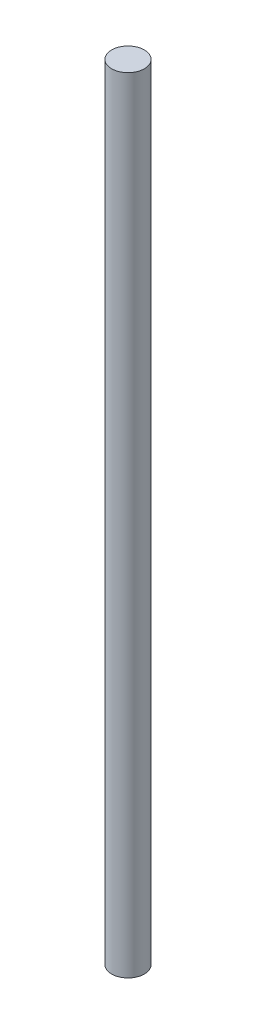
ISO-10303-21;
HEADER;
FILE_DESCRIPTION(('STEP AP214'),'2;1');
FILE_NAME('part.step','',(''),(''),'','','');
FILE_SCHEMA(('AUTOMOTIVE_DESIGN { 1 0 10303 214 1 1 1 1 }'));
ENDSEC;
DATA;
#1=APPLICATION_CONTEXT('core data for automotive mechanical design processes');
#2=APPLICATION_PROTOCOL_DEFINITION('international standard','automotive_design',2000,#1);
#3=PRODUCT_CONTEXT('',#1,'mechanical');
#4=PRODUCT('Part','Part','',(#3));
#5=PRODUCT_RELATED_PRODUCT_CATEGORY('part','',(#4));
#6=PRODUCT_DEFINITION_FORMATION('','',#4);
#7=PRODUCT_DEFINITION_CONTEXT('part definition',#1,'design');
#8=PRODUCT_DEFINITION('design','',#6,#7);
#9=PRODUCT_DEFINITION_SHAPE('','',#8);
#10=(LENGTH_UNIT() NAMED_UNIT(*) SI_UNIT(.MILLI.,.METRE.));
#11=(NAMED_UNIT(*) PLANE_ANGLE_UNIT() SI_UNIT($,.RADIAN.));
#12=(NAMED_UNIT(*) SI_UNIT($,.STERADIAN.) SOLID_ANGLE_UNIT());
#13=UNCERTAINTY_MEASURE_WITH_UNIT(LENGTH_MEASURE(1.E-05),#10,'distance_accuracy_value','');
#14=(GEOMETRIC_REPRESENTATION_CONTEXT(3) GLOBAL_UNCERTAINTY_ASSIGNED_CONTEXT((#13)) GLOBAL_UNIT_ASSIGNED_CONTEXT((#10,
#11,#12)) REPRESENTATION_CONTEXT('',''));
#15=CARTESIAN_POINT('',(0.,0.,0.));
#16=DIRECTION('',(0.,0.,1.));
#17=DIRECTION('',(1.,0.,0.));
#18=AXIS2_PLACEMENT_3D('',#15,#16,#17);
#19=CARTESIAN_POINT('',(0.,304.8,0.));
#20=DIRECTION('',(0.,-1.,0.));
#21=DIRECTION('',(0.,0.,-1.));
#22=AXIS2_PLACEMENT_3D('',#19,#20,#21);
#23=CYLINDRICAL_SURFACE('',#22,6.35);
#24=CARTESIAN_POINT('',(0.,304.8,0.));
#25=DIRECTION('',(0.,1.,0.));
#26=DIRECTION('',(0.,0.,1.));
#27=AXIS2_PLACEMENT_3D('',#24,#25,#26);
#28=CIRCLE('',#27,6.35);
#29=CARTESIAN_POINT('',(0.,304.8,-6.35));
#30=VERTEX_POINT('',#29);
#31=EDGE_CURVE('E10',#30,#30,#28,.T.);
#32=CARTESIAN_POINT('',(0.,0.,0.));
#33=DIRECTION('',(0.,1.,0.));
#34=DIRECTION('',(0.,0.,1.));
#35=AXIS2_PLACEMENT_3D('',#32,#33,#34);
#36=CIRCLE('',#35,6.35);
#37=CARTESIAN_POINT('',(0.,0.,-6.35));
#38=VERTEX_POINT('',#37);
#39=EDGE_CURVE('E34',#38,#38,#36,.T.);
#40=CARTESIAN_POINT('',(0.,304.8,-6.35));
#41=CARTESIAN_POINT('',(0.,301.625,-6.35));
#42=CARTESIAN_POINT('',(0.,298.45,-6.35));
#43=CARTESIAN_POINT('',(0.,292.1,-6.35));
#44=CARTESIAN_POINT('',(0.,288.925,-6.35));
#45=CARTESIAN_POINT('',(0.,282.575,-6.35));
#46=CARTESIAN_POINT('',(0.,279.4,-6.35));
#47=CARTESIAN_POINT('',(0.,273.05,-6.35));
#48=CARTESIAN_POINT('',(0.,269.875,-6.35));
#49=CARTESIAN_POINT('',(0.,263.525,-6.35));
#50=CARTESIAN_POINT('',(0.,260.35,-6.35));
#51=CARTESIAN_POINT('',(0.,254.,-6.35));
#52=CARTESIAN_POINT('',(0.,250.825,-6.35));
#53=CARTESIAN_POINT('',(0.,244.475,-6.35));
#54=CARTESIAN_POINT('',(0.,241.3,-6.35));
#55=CARTESIAN_POINT('',(0.,234.95,-6.35));
#56=CARTESIAN_POINT('',(0.,231.775,-6.35));
#57=CARTESIAN_POINT('',(0.,225.425,-6.35));
#58=CARTESIAN_POINT('',(0.,222.25,-6.35));
#59=CARTESIAN_POINT('',(0.,215.9,-6.35));
#60=CARTESIAN_POINT('',(0.,212.725,-6.35));
#61=CARTESIAN_POINT('',(0.,206.375,-6.35));
#62=CARTESIAN_POINT('',(0.,203.2,-6.35));
#63=CARTESIAN_POINT('',(0.,196.85,-6.35));
#64=CARTESIAN_POINT('',(0.,193.675,-6.35));
#65=CARTESIAN_POINT('',(0.,187.325,-6.35));
#66=CARTESIAN_POINT('',(0.,184.15,-6.35));
#67=CARTESIAN_POINT('',(0.,177.8,-6.35));
#68=CARTESIAN_POINT('',(0.,174.625,-6.35));
#69=CARTESIAN_POINT('',(0.,168.275,-6.35));
#70=CARTESIAN_POINT('',(0.,165.1,-6.35));
#71=CARTESIAN_POINT('',(0.,158.75,-6.35));
#72=CARTESIAN_POINT('',(0.,155.575,-6.35));
#73=CARTESIAN_POINT('',(0.,149.225,-6.35));
#74=CARTESIAN_POINT('',(0.,146.05,-6.35));
#75=CARTESIAN_POINT('',(0.,139.7,-6.35));
#76=CARTESIAN_POINT('',(0.,136.525,-6.35));
#77=CARTESIAN_POINT('',(0.,130.175,-6.35));
#78=CARTESIAN_POINT('',(0.,127.,-6.35));
#79=CARTESIAN_POINT('',(0.,120.65,-6.35));
#80=CARTESIAN_POINT('',(0.,117.475,-6.35));
#81=CARTESIAN_POINT('',(0.,111.125,-6.35));
#82=CARTESIAN_POINT('',(0.,107.95,-6.35));
#83=CARTESIAN_POINT('',(0.,101.6,-6.35));
#84=CARTESIAN_POINT('',(0.,98.425,-6.35));
#85=CARTESIAN_POINT('',(0.,92.075,-6.35));
#86=CARTESIAN_POINT('',(0.,88.9,-6.35));
#87=CARTESIAN_POINT('',(0.,82.55,-6.35));
#88=CARTESIAN_POINT('',(0.,79.375,-6.35));
#89=CARTESIAN_POINT('',(0.,73.025,-6.35));
#90=CARTESIAN_POINT('',(0.,69.85,-6.35));
#91=CARTESIAN_POINT('',(0.,63.5,-6.35));
#92=CARTESIAN_POINT('',(0.,60.325,-6.35));
#93=CARTESIAN_POINT('',(0.,53.975,-6.35));
#94=CARTESIAN_POINT('',(0.,50.8,-6.35));
#95=CARTESIAN_POINT('',(0.,44.45,-6.35));
#96=CARTESIAN_POINT('',(0.,41.275,-6.35));
#97=CARTESIAN_POINT('',(0.,34.925,-6.35));
#98=CARTESIAN_POINT('',(0.,31.75,-6.35));
#99=CARTESIAN_POINT('',(0.,25.4,-6.35));
#100=CARTESIAN_POINT('',(0.,22.225,-6.35));
#101=CARTESIAN_POINT('',(0.,15.875,-6.35));
#102=CARTESIAN_POINT('',(0.,12.7,-6.35));
#103=CARTESIAN_POINT('',(0.,6.35,-6.35));
#104=CARTESIAN_POINT('',(0.,3.175,-6.35));
#105=CARTESIAN_POINT('',(0.,0.,-6.35));
#106=B_SPLINE_CURVE_WITH_KNOTS('',3,(#40,#41,#42,#43,#44,#45,#46,#47,#48,#49,#50,#51,#52,#53,
#54,#55,#56,#57,#58,#59,#60,#61,#62,#63,#64,#65,#66,#67,#68,#69,#70,#71,#72,#73,#74,#75,#76,#77,
#78,#79,#80,#81,#82,#83,#84,#85,#86,#87,#88,#89,#90,#91,#92,#93,#94,#95,#96,#97,#98,#99,#100,
#101,#102,#103,#104,#105),.UNSPECIFIED.,.F.,.F.,(4,2,2,2,2,2,2,2,2,2,2,2,2,2,2,2,2,2,2,2,2,2,2,
2,2,2,2,2,2,2,2,2,4),(0.,9.52500000000001,19.05,28.575,38.1,47.625,57.15,66.675,76.2,
85.7250000000001,95.2500000000001,104.775,114.3,123.825,133.35,142.875,152.4,161.925,171.45,
180.975,190.5,200.025,209.55,219.075,228.6,238.125,247.65,257.175,266.7,276.225,285.75,295.275,
304.8),.UNSPECIFIED.);
#107=EDGE_CURVE('BSEAM31',#30,#38,#106,.T.);
#108=ORIENTED_EDGE('',*,*,#31,.F.);
#109=ORIENTED_EDGE('',*,*,#39,.T.);
#110=ORIENTED_EDGE('',*,*,#107,.T.);
#111=ORIENTED_EDGE('',*,*,#107,.F.);
#112=EDGE_LOOP('',(#108,#110,#109,#111));
#113=FACE_BOUND('',#112,.T.);
#114=ADVANCED_FACE('F31',(#113),#23,.T.);
#115=CARTESIAN_POINT('',(0.,304.8,0.));
#116=DIRECTION('',(0.,1.,0.));
#117=DIRECTION('',(0.,0.,1.));
#118=AXIS2_PLACEMENT_3D('',#115,#116,#117);
#119=PLANE('',#118);
#120=ORIENTED_EDGE('',*,*,#31,.T.);
#121=EDGE_LOOP('',(#120));
#122=FACE_BOUND('',#121,.T.);
#123=ADVANCED_FACE('F46',(#122),#119,.T.);
#124=CARTESIAN_POINT('',(0.,0.,0.));
#125=DIRECTION('',(0.,1.,0.));
#126=DIRECTION('',(0.,0.,1.));
#127=AXIS2_PLACEMENT_3D('',#124,#125,#126);
#128=PLANE('',#127);
#129=ORIENTED_EDGE('',*,*,#39,.F.);
#130=EDGE_LOOP('',(#129));
#131=FACE_BOUND('',#130,.T.);
#132=ADVANCED_FACE('F44',(#131),#128,.F.);
#133=CLOSED_SHELL('',(#114,#123,#132));
#134=MANIFOLD_SOLID_BREP('B2',#133);
#135=ADVANCED_BREP_SHAPE_REPRESENTATION('',(#18,#134),#14);
#136=SHAPE_DEFINITION_REPRESENTATION(#9,#135);
ENDSEC;
END-ISO-10303-21;
